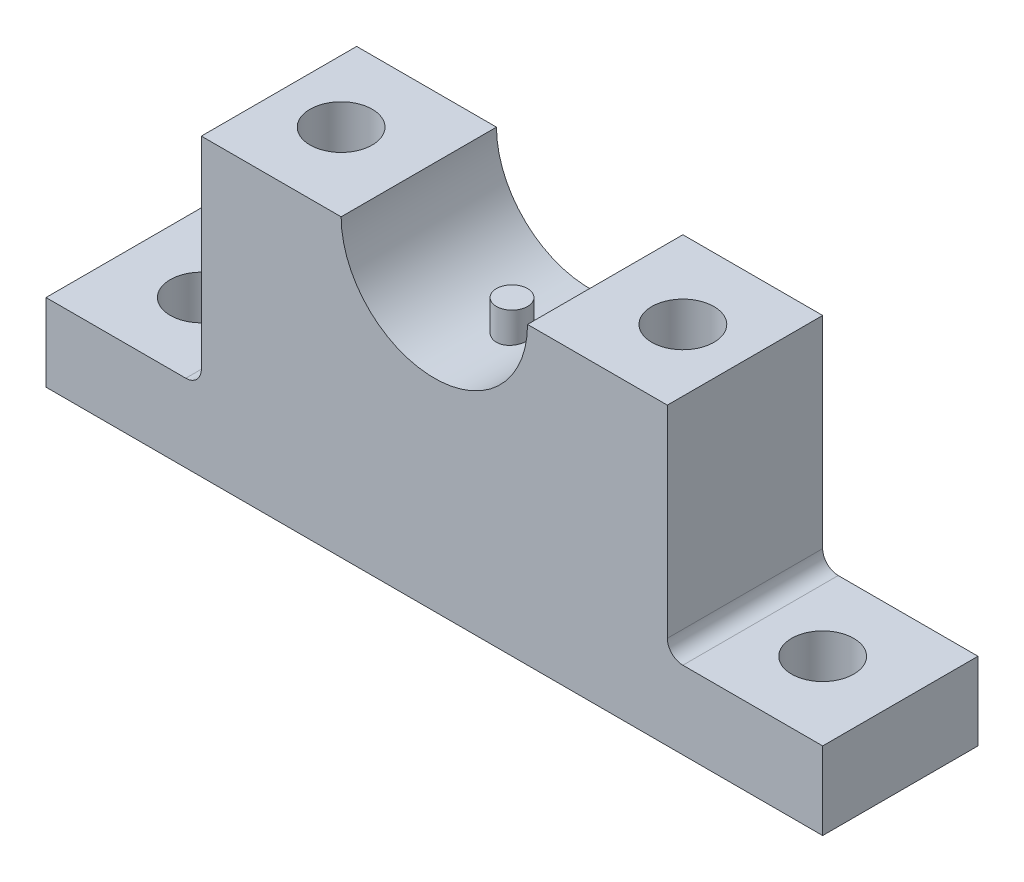
ISO-10303-21;
HEADER;
FILE_DESCRIPTION(('STEP AP214'),'2;1');
FILE_NAME('part.step','',(''),(''),'','','');
FILE_SCHEMA(('AUTOMOTIVE_DESIGN { 1 0 10303 214 1 1 1 1 }'));
ENDSEC;
DATA;
#1=APPLICATION_CONTEXT('core data for automotive mechanical design processes');
#2=APPLICATION_PROTOCOL_DEFINITION('international standard','automotive_design',2000,#1);
#3=PRODUCT_CONTEXT('',#1,'mechanical');
#4=PRODUCT('Part','Part','',(#3));
#5=PRODUCT_RELATED_PRODUCT_CATEGORY('part','',(#4));
#6=PRODUCT_DEFINITION_FORMATION('','',#4);
#7=PRODUCT_DEFINITION_CONTEXT('part definition',#1,'design');
#8=PRODUCT_DEFINITION('design','',#6,#7);
#9=PRODUCT_DEFINITION_SHAPE('','',#8);
#10=(LENGTH_UNIT() NAMED_UNIT(*) SI_UNIT(.MILLI.,.METRE.));
#11=(NAMED_UNIT(*) PLANE_ANGLE_UNIT() SI_UNIT($,.RADIAN.));
#12=(NAMED_UNIT(*) SI_UNIT($,.STERADIAN.) SOLID_ANGLE_UNIT());
#13=UNCERTAINTY_MEASURE_WITH_UNIT(LENGTH_MEASURE(1.E-05),#10,'distance_accuracy_value','');
#14=(GEOMETRIC_REPRESENTATION_CONTEXT(3) GLOBAL_UNCERTAINTY_ASSIGNED_CONTEXT((#13)) GLOBAL_UNIT_ASSIGNED_CONTEXT((#10,
#11,#12)) REPRESENTATION_CONTEXT('',''));
#15=CARTESIAN_POINT('',(0.,0.,0.));
#16=DIRECTION('',(0.,0.,1.));
#17=DIRECTION('',(1.,0.,0.));
#18=AXIS2_PLACEMENT_3D('',#15,#16,#17);
#19=CARTESIAN_POINT('',(0.,0.,5.));
#20=DIRECTION('',(0.,0.,-1.));
#21=DIRECTION('',(-1.,0.,0.));
#22=AXIS2_PLACEMENT_3D('',#19,#20,#21);
#23=CYLINDRICAL_SURFACE('',#22,6.);
#24=CARTESIAN_POINT('',(0.,-6.,1.));
#25=CARTESIAN_POINT('',(0.055756361983286,-5.99999904467529,0.999997764420874));
#26=CARTESIAN_POINT('',(0.111543152735528,-5.99921471165214,0.995321090012433));
#27=CARTESIAN_POINT('',(0.221552088669217,-5.99616137976555,0.976745736493871));
#28=CARTESIAN_POINT('',(0.275772747183699,-5.99389101569556,0.96283857723536));
#29=CARTESIAN_POINT('',(0.381041898885058,-5.9881202729458,0.926233820562899));
#30=CARTESIAN_POINT('',(0.432092947372761,-5.98462090063677,0.903543413743771));
#31=CARTESIAN_POINT('',(0.529656736791178,-5.97677690832828,0.850035083179043));
#32=CARTESIAN_POINT('',(0.576169995951437,-5.97243238501774,0.819218089006802));
#33=CARTESIAN_POINT('',(0.663789045716673,-5.96333326983325,0.750017966471817));
#34=CARTESIAN_POINT('',(0.704845161413988,-5.95857548725943,0.711572354145549));
#35=CARTESIAN_POINT('',(0.779955399463972,-5.94921050750693,0.628340812610876));
#36=CARTESIAN_POINT('',(0.814009079756389,-5.94460331985067,0.583554483417356));
#37=CARTESIAN_POINT('',(0.874346850242054,-5.93603026303912,0.488571613521178));
#38=CARTESIAN_POINT('',(0.900581821144402,-5.93206851636654,0.438343465278098));
#39=CARTESIAN_POINT('',(0.944223346164489,-5.9252791591787,0.33411617427975));
#40=CARTESIAN_POINT('',(0.961630496626246,-5.92245147205723,0.280117286528948));
#41=CARTESIAN_POINT('',(0.986965751113924,-5.91828214737102,0.170407890057385));
#42=CARTESIAN_POINT('',(0.994979611654162,-5.9169270739428,0.114717705399443));
#43=CARTESIAN_POINT('',(1.00156669011595,-5.9158157557466,0.00276788924661156));
#44=CARTESIAN_POINT('',(1.0001405761556,-5.91605939782886,-0.0534917016669197));
#45=CARTESIAN_POINT('',(0.987958039358462,-5.91810571545422,-0.16437114451018));
#46=CARTESIAN_POINT('',(0.97729795275591,-5.91989229327567,-0.219001921418094));
#47=CARTESIAN_POINT('',(0.947101256161379,-5.92479798084403,-0.325688527131654));
#48=CARTESIAN_POINT('',(0.927564341727897,-5.92791713629309,-0.377744267555419));
#49=CARTESIAN_POINT('',(0.880070898437566,-5.9351539173364,-0.478091529376368));
#50=CARTESIAN_POINT('',(0.852074365551886,-5.9392762684293,-0.526363762432491));
#51=CARTESIAN_POINT('',(0.788484807022974,-5.94805167366003,-0.617561760215355));
#52=CARTESIAN_POINT('',(0.752891168261716,-5.95270477061714,-0.660487092981973));
#53=CARTESIAN_POINT('',(0.674592884863622,-5.96208811151914,-0.740330434322939));
#54=CARTESIAN_POINT('',(0.631805585549252,-5.96681859692661,-0.777167407416034));
#55=CARTESIAN_POINT('',(0.540614099592659,-5.97577040558689,-0.843151105066137));
#56=CARTESIAN_POINT('',(0.492209876762569,-5.97999172555898,-0.872297780073292));
#57=CARTESIAN_POINT('',(0.391082366466685,-5.98745557157165,-0.922080890854514));
#58=CARTESIAN_POINT('',(0.338355490225865,-5.99069727362979,-0.942710167732504));
#59=CARTESIAN_POINT('',(0.230119338241093,-5.99583001205064,-0.974797686098392));
#60=CARTESIAN_POINT('',(0.174610295671787,-5.9977211614019,-0.986256694789488));
#61=CARTESIAN_POINT('',(0.0630839605206497,-5.99992451937074,-0.999568543384455));
#62=CARTESIAN_POINT('',(0.00708029486040463,-6.00025501205114,-1.00153262872224));
#63=CARTESIAN_POINT('',(-0.104455909155955,-5.99934989768468,-0.996095462228752));
#64=CARTESIAN_POINT('',(-0.159988465556816,-5.99811435089647,-0.988694570746507));
#65=CARTESIAN_POINT('',(-0.268662470218706,-5.99422730775281,-0.96483006026581));
#66=CARTESIAN_POINT('',(-0.321816347354152,-5.99158441920524,-0.948421516643951));
#67=CARTESIAN_POINT('',(-0.424618753944177,-5.98517785782143,-0.907066192720187));
#68=CARTESIAN_POINT('',(-0.474267086363888,-5.98141412204808,-0.882118932945892));
#69=CARTESIAN_POINT('',(-0.569132275787584,-5.97313806520963,-0.824139550121286));
#70=CARTESIAN_POINT('',(-0.614306100374859,-5.96861942354809,-0.7910379375331));
#71=CARTESIAN_POINT('',(-0.698497434201076,-5.9593538695676,-0.717785073845977));
#72=CARTESIAN_POINT('',(-0.737514495878634,-5.95460694068619,-0.677633310689333));
#73=CARTESIAN_POINT('',(-0.808697111863201,-5.94536070094338,-0.590920980771431));
#74=CARTESIAN_POINT('',(-0.840787504445487,-5.94086446454842,-0.544298333794237));
#75=CARTESIAN_POINT('',(-0.896680924117995,-5.93268611911154,-0.446258812344586));
#76=CARTESIAN_POINT('',(-0.92048421390793,-5.92900398426408,-0.394842089909003));
#77=CARTESIAN_POINT('',(-0.95901533258926,-5.92289381479082,-0.288884106875147));
#78=CARTESIAN_POINT('',(-0.973780573019179,-5.92046061724426,-0.234356761987805));
#79=CARTESIAN_POINT('',(-0.993934181511312,-5.91711086734104,-0.123551948311296));
#80=CARTESIAN_POINT('',(-0.999323364778468,-5.91619418313089,-0.0672746321071795));
#81=CARTESIAN_POINT('',(-1.00054914641894,-5.91598693233605,0.0446820663849635));
#82=CARTESIAN_POINT('',(-0.996504054450076,-5.9166762260226,0.100360151430115));
#83=CARTESIAN_POINT('',(-0.97923193558274,-5.91955912581491,0.210231699220306));
#84=CARTESIAN_POINT('',(-0.966004938444992,-5.92175272704486,0.264425166776749));
#85=CARTESIAN_POINT('',(-0.930789795837962,-5.92738942512687,0.369743374917046));
#86=CARTESIAN_POINT('',(-0.908811836240178,-5.93083106887868,0.42087160402241));
#87=CARTESIAN_POINT('',(-0.856730801566364,-5.93857747568883,0.518734267677939));
#88=CARTESIAN_POINT('',(-0.826627323499426,-5.9428822815536,0.565468484148854));
#89=CARTESIAN_POINT('',(-0.758727553748863,-5.95193381618249,0.653814233243102));
#90=CARTESIAN_POINT('',(-0.72084422543746,-5.95668518230521,0.69535840668011));
#91=CARTESIAN_POINT('',(-0.638643612552093,-5.96605748944336,0.771540641789975));
#92=CARTESIAN_POINT('',(-0.594324845165055,-5.97067840010619,0.806177107455269));
#93=CARTESIAN_POINT('',(-0.500147667856113,-5.97930611856888,0.867779307279979));
#94=CARTESIAN_POINT('',(-0.450253115013128,-5.98330846501242,0.894690415725181));
#95=CARTESIAN_POINT('',(-0.346605227751593,-5.9902046704071,0.939707793843969));
#96=CARTESIAN_POINT('',(-0.292855797932004,-5.99309963270993,0.95782283243188));
#97=CARTESIAN_POINT('',(-0.199081324018161,-5.99682316333182,0.980802109650667));
#98=CARTESIAN_POINT('',(-0.159623532119379,-5.99800810909344,0.987989787846387));
#99=CARTESIAN_POINT('',(-0.0801157241279241,-5.99959686394448,0.997589495137902));
#100=CARTESIAN_POINT('',(-0.0400657182433979,-6.00000068648257,1.00000160645495));
#101=CARTESIAN_POINT('',(0.,-6.,1.));
#102=B_SPLINE_CURVE_WITH_KNOTS('',3,(#24,#25,#26,#27,#28,#29,#30,#31,#32,#33,#34,#35,#36,#37,
#38,#39,#40,#41,#42,#43,#44,#45,#46,#47,#48,#49,#50,#51,#52,#53,#54,#55,#56,#57,#58,#59,#60,#61,
#62,#63,#64,#65,#66,#67,#68,#69,#70,#71,#72,#73,#74,#75,#76,#77,#78,#79,#80,#81,#82,#83,#84,#85,
#86,#87,#88,#89,#90,#91,#92,#93,#94,#95,#96,#97,#98,#99,#100,#101),.UNSPECIFIED.,.T.,.F.,(4,2,2,
2,2,2,2,2,2,2,2,2,2,2,2,2,2,2,2,2,2,2,2,2,2,2,2,2,2,2,2,2,2,2,2,2,2,2,4),(0.,0.167122633975404,
0.334399018278168,0.501538746810108,0.668659365069917,0.837209964249329,1.00577120067943,
1.17537008329536,1.34495750750473,1.5129843084137,1.68099921728355,1.84728208704164,
2.01357066010153,2.18065822653023,2.3477592827223,2.51693107964531,2.68610396654339,
2.85541875566362,3.0247193780846,3.19203153396559,3.35933725214344,3.52563122802567,
3.69193454330427,3.8597073025081,4.02749225221714,4.19701528803048,4.36653294950378,
4.53534408936709,4.70414055114648,4.87083163809081,5.03752218475254,5.2040192729049,
5.37052462011735,5.53900553677357,5.7075253355159,5.87720892642881,6.04672300852029,
6.16681699265608,6.28690890910788),.UNSPECIFIED.);
#103=CARTESIAN_POINT('',(0.,-6.,1.));
#104=VERTEX_POINT('',#103);
#105=EDGE_CURVE('E11',#104,#104,#102,.T.);
#106=ORIENTED_EDGE('',*,*,#105,.F.);
#107=EDGE_LOOP('',(#106));
#108=FACE_BOUND('',#107,.T.);
#109=ADVANCED_FACE('F45',(#108),#23,.T.);
#110=CARTESIAN_POINT('',(0.,-4.,0.));
#111=DIRECTION('',(0.,1.,0.));
#112=DIRECTION('',(0.,0.,1.));
#113=AXIS2_PLACEMENT_3D('',#110,#111,#112);
#114=PLANE('',#113);
#115=CARTESIAN_POINT('',(0.,-4.,0.));
#116=DIRECTION('',(0.,1.,0.));
#117=DIRECTION('',(0.,0.,1.));
#118=AXIS2_PLACEMENT_3D('',#115,#116,#117);
#119=CIRCLE('',#118,1.);
#120=CARTESIAN_POINT('',(0.,-4.,1.));
#121=VERTEX_POINT('',#120);
#122=EDGE_CURVE('E55',#121,#121,#119,.T.);
#123=ORIENTED_EDGE('',*,*,#122,.T.);
#124=EDGE_LOOP('',(#123));
#125=FACE_BOUND('',#124,.T.);
#126=ADVANCED_FACE('F61',(#125),#114,.T.);
#127=CARTESIAN_POINT('',(0.,-19.001,0.));
#128=DIRECTION('',(0.,1.,0.));
#129=DIRECTION('',(0.,0.,1.));
#130=AXIS2_PLACEMENT_3D('',#127,#128,#129);
#131=CYLINDRICAL_SURFACE('',#130,1.);
#132=ORIENTED_EDGE('',*,*,#122,.F.);
#133=EDGE_LOOP('',(#132));
#134=FACE_BOUND('',#133,.T.);
#135=ORIENTED_EDGE('',*,*,#105,.T.);
#136=EDGE_LOOP('',(#135));
#137=FACE_BOUND('',#136,.T.);
#138=ADVANCED_FACE('F63',(#134,#137),#131,.T.);
#139=CLOSED_SHELL('',(#109,#126,#138));
#140=MANIFOLD_SOLID_BREP('B2',#139);
#141=CARTESIAN_POINT('',(0.,0.,5.));
#142=DIRECTION('',(0.,0.,-1.));
#143=DIRECTION('',(-1.,0.,0.));
#144=AXIS2_PLACEMENT_3D('',#141,#142,#143);
#145=CYLINDRICAL_SURFACE('',#144,6.);
#146=CARTESIAN_POINT('',(-0.999999999999999,-5.91607978309962,0.));
#147=CARTESIAN_POINT('',(-0.999997759368401,-5.91608078960511,-0.0557502992584118));
#148=CARTESIAN_POINT('',(-0.995322067614928,-5.91687637019227,-0.111531042409948));
#149=CARTESIAN_POINT('',(-0.976750971230156,-5.91996982947271,-0.221527417288066));
#150=CARTESIAN_POINT('',(-0.96284706412386,-5.92226909356571,-0.27574155749981));
#151=CARTESIAN_POINT('',(-0.926251817466856,-5.9281024372893,-0.380996913342711));
#152=CARTESIAN_POINT('',(-0.903567821972434,-5.9316354846878,-0.432040739466525));
#153=CARTESIAN_POINT('',(-0.850074598756146,-5.93953708845736,-0.529592381885484));
#154=CARTESIAN_POINT('',(-0.819266285400627,-5.94390555078989,-0.576100707830495));
#155=CARTESIAN_POINT('',(-0.750075010786519,-5.95303388461043,-0.663725139898267));
#156=CARTESIAN_POINT('',(-0.711627619572908,-5.95779686930827,-0.704790052554605));
#157=CARTESIAN_POINT('',(-0.628388801878135,-5.96714992267783,-0.779917322744606));
#158=CARTESIAN_POINT('',(-0.583596999659995,-5.97173998108788,-0.813979265246135));
#159=CARTESIAN_POINT('',(-0.488609147979335,-5.98026294792988,-0.874325826887742));
#160=CARTESIAN_POINT('',(-0.438382432582681,-5.98419176972911,-0.90056280309273));
#161=CARTESIAN_POINT('',(-0.334158248689549,-5.99091494782862,-0.944208428212213));
#162=CARTESIAN_POINT('',(-0.280161025631275,-5.9937093778907,-0.961617651153948));
#163=CARTESIAN_POINT('',(-0.170457490537696,-5.99782693889752,-0.986957013993562));
#164=CARTESIAN_POINT('',(-0.114771554671708,-5.99916341244362,-0.994973166401878));
#165=CARTESIAN_POINT('',(-0.00283011421031848,-6.00026031737112,-1.00156630166104));
#166=CARTESIAN_POINT('',(0.0534253514115599,-6.00002085587723,-1.00014392609889));
#167=CARTESIAN_POINT('',(0.164320874031551,-5.99800343372556,-0.987967459388716));
#168=CARTESIAN_POINT('',(0.218971412280057,-5.99624073476959,-0.977305934636339));
#169=CARTESIAN_POINT('',(0.325696791844717,-5.99139191508655,-0.947099570301403));
#170=CARTESIAN_POINT('',(0.377771554660602,-5.98830575405284,-0.9275544601642));
#171=CARTESIAN_POINT('',(0.47814245911306,-5.98113079404783,-0.880043743873873));
#172=CARTESIAN_POINT('',(0.526420209207618,-5.97703746930752,-0.852039995167024));
#173=CARTESIAN_POINT('',(0.617626211938657,-5.96830295228599,-0.788434870945981));
#174=CARTESIAN_POINT('',(0.660554031166351,-5.96366171567654,-0.752832880515674));
#175=CARTESIAN_POINT('',(0.740388509378667,-5.95428107293038,-0.674528477352278));
#176=CARTESIAN_POINT('',(0.777215800901283,-5.94954115892417,-0.631745162039607));
#177=CARTESIAN_POINT('',(0.843181835379226,-5.94055183913922,-0.540565163913673));
#178=CARTESIAN_POINT('',(0.872320507412967,-5.9363024378853,-0.492168429326873));
#179=CARTESIAN_POINT('',(0.922097773795315,-5.92877501824727,-0.391043343249009));
#180=CARTESIAN_POINT('',(0.942726810911697,-5.9254980932104,-0.338310200763164));
#181=CARTESIAN_POINT('',(0.974811948326248,-5.92030475475952,-0.230060371076983));
#182=CARTESIAN_POINT('',(0.986268856307183,-5.91838822155328,-0.174543929427031));
#183=CARTESIAN_POINT('',(0.999572753951707,-5.91615583768846,-0.0630135375351479));
#184=CARTESIAN_POINT('',(1.00153288316498,-5.91582114303468,-0.00701344811915974));
#185=CARTESIAN_POINT('',(0.996089081072984,-5.91674013912944,0.104514668676328));
#186=CARTESIAN_POINT('',(0.988685511449867,-5.91799376852741,0.160042714205589));
#187=CARTESIAN_POINT('',(0.96482093397124,-5.92193074982007,0.268691103676343));
#188=CARTESIAN_POINT('',(0.948417516258555,-5.92460500767339,0.321824455951204));
#189=CARTESIAN_POINT('',(0.907079276076911,-5.93107429202201,0.424588066511794));
#190=CARTESIAN_POINT('',(0.882143943240375,-5.93486938556232,0.474218115020361));
#191=CARTESIAN_POINT('',(0.824182669291692,-5.94319651358957,0.569069837762444));
#192=CARTESIAN_POINT('',(0.791084225663746,-5.94773502240139,0.614246629102423));
#193=CARTESIAN_POINT('',(0.717835786283194,-5.95701866671947,0.698445413078001));
#194=CARTESIAN_POINT('',(0.677685294553619,-5.96176381674132,0.737466972443896));
#195=CARTESIAN_POINT('',(0.590971228131525,-5.97098568847306,0.808660757091481));
#196=CARTESIAN_POINT('',(0.544345301354479,-5.97545910537869,0.840757530513817));
#197=CARTESIAN_POINT('',(0.446297379179731,-5.98358044973177,0.896662130801952));
#198=CARTESIAN_POINT('',(0.394875538988252,-5.9872284038799,0.92047022578954));
#199=CARTESIAN_POINT('',(0.288919620600532,-5.99327343267833,0.959004233581946));
#200=CARTESIAN_POINT('',(0.234400225041045,-5.99567593827049,0.973769630293967));
#201=CARTESIAN_POINT('',(0.123612293949686,-5.99898233267712,0.993926239585532));
#202=CARTESIAN_POINT('',(0.0673439027286505,-5.99988634480071,0.999318223492944));
#203=CARTESIAN_POINT('',(-0.0446165103094716,-6.0000921515513,1.00055275292488));
#204=CARTESIAN_POINT('',(-0.100307264241071,-5.99941320809696,0.996510101576422));
#205=CARTESIAN_POINT('',(-0.210204789725876,-5.99656871354913,0.97923843109224));
#206=CARTESIAN_POINT('',(-0.264411569586969,-5.99440317078001,0.966009463396175));
#207=CARTESIAN_POINT('',(-0.369758578367436,-5.98882795531034,0.930784733782497));
#208=CARTESIAN_POINT('',(-0.420902148861608,-5.98541966816622,0.908798732715821));
#209=CARTESIAN_POINT('',(-0.518792181192785,-5.97773102750941,0.856696825507926));
#210=CARTESIAN_POINT('',(-0.565538434446985,-5.97345063265953,0.826580533975613));
#211=CARTESIAN_POINT('',(-0.653885178210863,-5.96443051847589,0.758665963015201));
#212=CARTESIAN_POINT('',(-0.695420572242245,-5.95968609820293,0.72078361809725));
#213=CARTESIAN_POINT('',(-0.771585550379216,-5.95030521321901,0.638588676840723));
#214=CARTESIAN_POINT('',(-0.806213514680475,-5.94566877405441,0.594274576443382));
#215=CARTESIAN_POINT('',(-0.867805708367844,-5.93699337428039,0.500101870996945));
#216=CARTESIAN_POINT('',(-0.894713995637815,-5.93295887192494,0.450206264064781));
#217=CARTESIAN_POINT('',(-0.939725814576364,-5.92599684088708,0.346556305635426));
#218=CARTESIAN_POINT('',(-0.95783814209264,-5.92306820700509,0.292805870921243));
#219=CARTESIAN_POINT('',(-0.980810421248856,-5.91929897935112,0.199038492209334));
#220=CARTESIAN_POINT('',(-0.987994967068111,-5.91809849368407,0.159589276816626));
#221=CARTESIAN_POINT('',(-0.997590518072968,-5.91648854114608,0.0800986060635571));
#222=CARTESIAN_POINT('',(-1.00000160991677,-5.91607905991511,0.0400571614679346));
#223=CARTESIAN_POINT('',(-0.999999999999999,-5.91607978309962,0.));
#224=B_SPLINE_CURVE_WITH_KNOTS('',3,(#146,#147,#148,#149,#150,#151,#152,#153,#154,#155,#156,
#157,#158,#159,#160,#161,#162,#163,#164,#165,#166,#167,#168,#169,#170,#171,#172,#173,#174,#175,
#176,#177,#178,#179,#180,#181,#182,#183,#184,#185,#186,#187,#188,#189,#190,#191,#192,#193,#194,
#195,#196,#197,#198,#199,#200,#201,#202,#203,#204,#205,#206,#207,#208,#209,#210,#211,#212,#213,
#214,#215,#216,#217,#218,#219,#220,#221,#222,#223),.UNSPECIFIED.,.T.,.F.,(4,2,2,2,2,2,2,2,2,2,2,
2,2,2,2,2,2,2,2,2,2,2,2,2,2,2,2,2,2,2,2,2,2,2,2,2,2,2,4),(0.,0.167104415562127,
0.334363007967779,0.501481999132666,0.668582189603687,0.83715663660545,1.00574107132038,
1.17533192042833,1.34491174042704,1.51292626987285,1.68092937859336,1.84726848464126,
2.01361265698072,2.18071841654029,2.34783770488965,2.51698449383108,2.68613284296667,
2.85547064997701,3.0247935437349,3.19209416966423,3.3593883336385,3.52562425852456,
3.69187012915689,3.8596493710334,4.02744041770535,4.19697645212412,4.36650700188938,
4.53529193765317,4.70406298363199,4.87079110504626,5.03751829285788,5.20406015931242,
5.37060992155193,5.5390679898356,5.70756551550984,5.8772549104514,6.04677426695051,
6.16684268214775,6.28690891757997),.UNSPECIFIED.);
#225=CARTESIAN_POINT('',(-0.999999999999999,-5.91607978309962,0.));
#226=VERTEX_POINT('',#225);
#227=EDGE_CURVE('E95',#226,#226,#224,.T.);
#228=ORIENTED_EDGE('',*,*,#227,.T.);
#229=EDGE_LOOP('',(#228));
#230=FACE_BOUND('',#229,.T.);
#231=CARTESIAN_POINT('',(0.,0.,-5.));
#232=DIRECTION('',(0.,0.,-1.));
#233=DIRECTION('',(1.,0.,0.));
#234=AXIS2_PLACEMENT_3D('',#231,#232,#233);
#235=CIRCLE('',#234,6.);
#236=CARTESIAN_POINT('',(6.,0.,-5.));
#237=VERTEX_POINT('',#236);
#238=CARTESIAN_POINT('',(-6.,0.,-5.));
#239=VERTEX_POINT('',#238);
#240=EDGE_CURVE('E217',#237,#239,#235,.T.);
#241=ORIENTED_EDGE('',*,*,#240,.T.);
#242=DIRECTION('',(0.,0.,-1.));
#243=VECTOR('',#242,1.);
#244=CARTESIAN_POINT('',(-6.,0.,5.));
#245=LINE('',#244,#243);
#246=CARTESIAN_POINT('',(-6.,0.,5.));
#247=VERTEX_POINT('',#246);
#248=EDGE_CURVE('E43',#247,#239,#245,.T.);
#249=ORIENTED_EDGE('',*,*,#248,.F.);
#250=CARTESIAN_POINT('',(0.,0.,5.));
#251=DIRECTION('',(0.,0.,-1.));
#252=DIRECTION('',(1.,0.,0.));
#253=AXIS2_PLACEMENT_3D('',#250,#251,#252);
#254=CIRCLE('',#253,6.);
#255=CARTESIAN_POINT('',(6.,0.,5.));
#256=VERTEX_POINT('',#255);
#257=EDGE_CURVE('E240',#256,#247,#254,.T.);
#258=ORIENTED_EDGE('',*,*,#257,.F.);
#259=DIRECTION('',(0.,0.,-1.));
#260=VECTOR('',#259,1.);
#261=CARTESIAN_POINT('',(6.,0.,5.));
#262=LINE('',#261,#260);
#263=EDGE_CURVE('E213',#256,#237,#262,.T.);
#264=ORIENTED_EDGE('',*,*,#263,.T.);
#265=EDGE_LOOP('',(#241,#249,#258,#264));
#266=FACE_BOUND('',#265,.T.);
#267=ADVANCED_FACE('F91',(#230,#266),#145,.F.);
#268=CARTESIAN_POINT('',(-6.,0.,5.));
#269=DIRECTION('',(0.,-1.,0.));
#270=DIRECTION('',(1.,0.,0.));
#271=AXIS2_PLACEMENT_3D('',#268,#269,#270);
#272=PLANE('',#271);
#273=CARTESIAN_POINT('',(-11.,0.,0.));
#274=DIRECTION('',(0.,1.,0.));
#275=DIRECTION('',(-1.,0.,0.));
#276=AXIS2_PLACEMENT_3D('',#273,#274,#275);
#277=CIRCLE('',#276,2.);
#278=CARTESIAN_POINT('',(-13.,0.,0.));
#279=VERTEX_POINT('',#278);
#280=EDGE_CURVE('E344',#279,#279,#277,.T.);
#281=ORIENTED_EDGE('',*,*,#280,.F.);
#282=EDGE_LOOP('',(#281));
#283=FACE_BOUND('',#282,.T.);
#284=DIRECTION('',(-1.,0.,0.));
#285=VECTOR('',#284,1.);
#286=CARTESIAN_POINT('',(-6.,0.,-5.));
#287=LINE('',#286,#285);
#288=CARTESIAN_POINT('',(-15.,0.,-5.));
#289=VERTEX_POINT('',#288);
#290=EDGE_CURVE('E220',#239,#289,#287,.T.);
#291=ORIENTED_EDGE('',*,*,#290,.T.);
#292=DIRECTION('',(0.,0.,-1.));
#293=VECTOR('',#292,1.);
#294=CARTESIAN_POINT('',(-15.,0.,5.));
#295=LINE('',#294,#293);
#296=CARTESIAN_POINT('',(-15.,0.,5.));
#297=VERTEX_POINT('',#296);
#298=EDGE_CURVE('E105',#297,#289,#295,.T.);
#299=ORIENTED_EDGE('',*,*,#298,.F.);
#300=DIRECTION('',(-1.,0.,0.));
#301=VECTOR('',#300,1.);
#302=CARTESIAN_POINT('',(-6.,0.,5.));
#303=LINE('',#302,#301);
#304=EDGE_CURVE('E168',#247,#297,#303,.T.);
#305=ORIENTED_EDGE('',*,*,#304,.F.);
#306=ORIENTED_EDGE('',*,*,#248,.T.);
#307=EDGE_LOOP('',(#291,#299,#305,#306));
#308=FACE_BOUND('',#307,.T.);
#309=ADVANCED_FACE('F321',(#283,#308),#272,.F.);
#310=CARTESIAN_POINT('',(-15.,0.,5.));
#311=DIRECTION('',(1.,0.,0.));
#312=DIRECTION('',(0.,0.,-1.));
#313=AXIS2_PLACEMENT_3D('',#310,#311,#312);
#314=PLANE('',#313);
#315=DIRECTION('',(0.,-1.,0.));
#316=VECTOR('',#315,1.);
#317=CARTESIAN_POINT('',(-15.,0.,-5.));
#318=LINE('',#317,#316);
#319=CARTESIAN_POINT('',(-15.,-13.,-5.));
#320=VERTEX_POINT('',#319);
#321=EDGE_CURVE('E223',#289,#320,#318,.T.);
#322=ORIENTED_EDGE('',*,*,#321,.T.);
#323=DIRECTION('',(0.,0.,-1.));
#324=VECTOR('',#323,1.);
#325=CARTESIAN_POINT('',(-15.,-13.,5.));
#326=LINE('',#325,#324);
#327=CARTESIAN_POINT('',(-15.,-13.,5.));
#328=VERTEX_POINT('',#327);
#329=EDGE_CURVE('E259',#328,#320,#326,.T.);
#330=ORIENTED_EDGE('',*,*,#329,.F.);
#331=DIRECTION('',(0.,-1.,0.));
#332=VECTOR('',#331,1.);
#333=CARTESIAN_POINT('',(-15.,0.,5.));
#334=LINE('',#333,#332);
#335=EDGE_CURVE('E268',#297,#328,#334,.T.);
#336=ORIENTED_EDGE('',*,*,#335,.F.);
#337=ORIENTED_EDGE('',*,*,#298,.T.);
#338=EDGE_LOOP('',(#322,#330,#336,#337));
#339=FACE_BOUND('',#338,.T.);
#340=ADVANCED_FACE('F266',(#339),#314,.F.);
#341=CARTESIAN_POINT('',(-16.,-13.,5.));
#342=DIRECTION('',(0.,0.,-1.));
#343=DIRECTION('',(-1.,0.,0.));
#344=AXIS2_PLACEMENT_3D('',#341,#342,#343);
#345=CYLINDRICAL_SURFACE('',#344,1.);
#346=CARTESIAN_POINT('',(-16.,-13.,-5.));
#347=DIRECTION('',(0.,0.,-1.));
#348=DIRECTION('',(-1.,0.,0.));
#349=AXIS2_PLACEMENT_3D('',#346,#347,#348);
#350=CIRCLE('',#349,1.);
#351=CARTESIAN_POINT('',(-16.,-14.,-5.));
#352=VERTEX_POINT('',#351);
#353=EDGE_CURVE('E225',#320,#352,#350,.T.);
#354=ORIENTED_EDGE('',*,*,#353,.T.);
#355=DIRECTION('',(0.,0.,-1.));
#356=VECTOR('',#355,1.);
#357=CARTESIAN_POINT('',(-16.,-14.,5.));
#358=LINE('',#357,#356);
#359=CARTESIAN_POINT('',(-16.,-14.,5.));
#360=VERTEX_POINT('',#359);
#361=EDGE_CURVE('E256',#360,#352,#358,.T.);
#362=ORIENTED_EDGE('',*,*,#361,.F.);
#363=CARTESIAN_POINT('',(-16.,-13.,5.));
#364=DIRECTION('',(0.,0.,-1.));
#365=DIRECTION('',(-1.,0.,0.));
#366=AXIS2_PLACEMENT_3D('',#363,#364,#365);
#367=CIRCLE('',#366,1.);
#368=EDGE_CURVE('E286',#328,#360,#367,.T.);
#369=ORIENTED_EDGE('',*,*,#368,.F.);
#370=ORIENTED_EDGE('',*,*,#329,.T.);
#371=EDGE_LOOP('',(#354,#362,#369,#370));
#372=FACE_BOUND('',#371,.T.);
#373=ADVANCED_FACE('F277',(#372),#345,.F.);
#374=CARTESIAN_POINT('',(-16.,-14.,5.));
#375=DIRECTION('',(0.,-1.,0.));
#376=DIRECTION('',(1.,0.,0.));
#377=AXIS2_PLACEMENT_3D('',#374,#375,#376);
#378=PLANE('',#377);
#379=CARTESIAN_POINT('',(-20.,-14.,0.));
#380=DIRECTION('',(0.,1.,0.));
#381=DIRECTION('',(-1.,0.,0.));
#382=AXIS2_PLACEMENT_3D('',#379,#380,#381);
#383=CIRCLE('',#382,2.);
#384=CARTESIAN_POINT('',(-22.,-14.,0.));
#385=VERTEX_POINT('',#384);
#386=EDGE_CURVE('E351',#385,#385,#383,.T.);
#387=ORIENTED_EDGE('',*,*,#386,.F.);
#388=EDGE_LOOP('',(#387));
#389=FACE_BOUND('',#388,.T.);
#390=DIRECTION('',(-1.,0.,0.));
#391=VECTOR('',#390,1.);
#392=CARTESIAN_POINT('',(-16.,-14.,-5.));
#393=LINE('',#392,#391);
#394=CARTESIAN_POINT('',(-25.,-14.,-5.));
#395=VERTEX_POINT('',#394);
#396=EDGE_CURVE('E227',#352,#395,#393,.T.);
#397=ORIENTED_EDGE('',*,*,#396,.T.);
#398=DIRECTION('',(0.,0.,-1.));
#399=VECTOR('',#398,1.);
#400=CARTESIAN_POINT('',(-25.,-14.,5.));
#401=LINE('',#400,#399);
#402=CARTESIAN_POINT('',(-25.,-14.,5.));
#403=VERTEX_POINT('',#402);
#404=EDGE_CURVE('E253',#403,#395,#401,.T.);
#405=ORIENTED_EDGE('',*,*,#404,.F.);
#406=DIRECTION('',(-1.,0.,0.));
#407=VECTOR('',#406,1.);
#408=CARTESIAN_POINT('',(-16.,-14.,5.));
#409=LINE('',#408,#407);
#410=EDGE_CURVE('E283',#360,#403,#409,.T.);
#411=ORIENTED_EDGE('',*,*,#410,.F.);
#412=ORIENTED_EDGE('',*,*,#361,.T.);
#413=EDGE_LOOP('',(#397,#405,#411,#412));
#414=FACE_BOUND('',#413,.T.);
#415=ADVANCED_FACE('F281',(#389,#414),#378,.F.);
#416=CARTESIAN_POINT('',(-25.,-14.,5.));
#417=DIRECTION('',(1.,0.,0.));
#418=DIRECTION('',(0.,1.,0.));
#419=AXIS2_PLACEMENT_3D('',#416,#417,#418);
#420=PLANE('',#419);
#421=DIRECTION('',(0.,-1.,0.));
#422=VECTOR('',#421,1.);
#423=CARTESIAN_POINT('',(-25.,-14.,-5.));
#424=LINE('',#423,#422);
#425=CARTESIAN_POINT('',(-25.,-19.,-5.));
#426=VERTEX_POINT('',#425);
#427=EDGE_CURVE('E229',#395,#426,#424,.T.);
#428=ORIENTED_EDGE('',*,*,#427,.T.);
#429=DIRECTION('',(0.,0.,-1.));
#430=VECTOR('',#429,1.);
#431=CARTESIAN_POINT('',(-25.,-19.,5.));
#432=LINE('',#431,#430);
#433=CARTESIAN_POINT('',(-25.,-19.,5.));
#434=VERTEX_POINT('',#433);
#435=EDGE_CURVE('E250',#434,#426,#432,.T.);
#436=ORIENTED_EDGE('',*,*,#435,.F.);
#437=DIRECTION('',(0.,-1.,0.));
#438=VECTOR('',#437,1.);
#439=CARTESIAN_POINT('',(-25.,-14.,5.));
#440=LINE('',#439,#438);
#441=EDGE_CURVE('E285',#403,#434,#440,.T.);
#442=ORIENTED_EDGE('',*,*,#441,.F.);
#443=ORIENTED_EDGE('',*,*,#404,.T.);
#444=EDGE_LOOP('',(#428,#436,#442,#443));
#445=FACE_BOUND('',#444,.T.);
#446=ADVANCED_FACE('F376',(#445),#420,.F.);
#447=CARTESIAN_POINT('',(-25.,-19.,5.));
#448=DIRECTION('',(0.,1.,0.));
#449=DIRECTION('',(-1.,0.,0.));
#450=AXIS2_PLACEMENT_3D('',#447,#448,#449);
#451=PLANE('',#450);
#452=CARTESIAN_POINT('',(-20.,-19.,0.));
#453=DIRECTION('',(0.,1.,0.));
#454=DIRECTION('',(-1.,0.,0.));
#455=AXIS2_PLACEMENT_3D('',#452,#453,#454);
#456=CIRCLE('',#455,2.);
#457=CARTESIAN_POINT('',(-22.,-19.,0.));
#458=VERTEX_POINT('',#457);
#459=EDGE_CURVE('E221',#458,#458,#456,.T.);
#460=ORIENTED_EDGE('',*,*,#459,.T.);
#461=EDGE_LOOP('',(#460));
#462=FACE_BOUND('',#461,.T.);
#463=CARTESIAN_POINT('',(20.,-19.,0.));
#464=DIRECTION('',(0.,1.,0.));
#465=DIRECTION('',(-1.,0.,0.));
#466=AXIS2_PLACEMENT_3D('',#463,#464,#465);
#467=CIRCLE('',#466,2.);
#468=CARTESIAN_POINT('',(18.,-19.,0.));
#469=VERTEX_POINT('',#468);
#470=EDGE_CURVE('E354',#469,#469,#467,.T.);
#471=ORIENTED_EDGE('',*,*,#470,.T.);
#472=EDGE_LOOP('',(#471));
#473=FACE_BOUND('',#472,.T.);
#474=DIRECTION('',(1.,0.,0.));
#475=VECTOR('',#474,1.);
#476=CARTESIAN_POINT('',(-25.,-19.,-5.));
#477=LINE('',#476,#475);
#478=CARTESIAN_POINT('',(25.,-19.,-5.));
#479=VERTEX_POINT('',#478);
#480=EDGE_CURVE('E231',#426,#479,#477,.T.);
#481=ORIENTED_EDGE('',*,*,#480,.T.);
#482=DIRECTION('',(0.,0.,-1.));
#483=VECTOR('',#482,1.);
#484=CARTESIAN_POINT('',(25.,-19.,5.));
#485=LINE('',#484,#483);
#486=CARTESIAN_POINT('',(25.,-19.,5.));
#487=VERTEX_POINT('',#486);
#488=EDGE_CURVE('E247',#487,#479,#485,.T.);
#489=ORIENTED_EDGE('',*,*,#488,.F.);
#490=DIRECTION('',(1.,0.,0.));
#491=VECTOR('',#490,1.);
#492=CARTESIAN_POINT('',(-25.,-19.,5.));
#493=LINE('',#492,#491);
#494=EDGE_CURVE('E288',#434,#487,#493,.T.);
#495=ORIENTED_EDGE('',*,*,#494,.F.);
#496=ORIENTED_EDGE('',*,*,#435,.T.);
#497=EDGE_LOOP('',(#481,#489,#495,#496));
#498=FACE_BOUND('',#497,.T.);
#499=ADVANCED_FACE('F371',(#462,#473,#498),#451,.F.);
#500=CARTESIAN_POINT('',(25.,-19.,5.));
#501=DIRECTION('',(-1.,0.,0.));
#502=DIRECTION('',(0.,-1.,0.));
#503=AXIS2_PLACEMENT_3D('',#500,#501,#502);
#504=PLANE('',#503);
#505=DIRECTION('',(0.,1.,0.));
#506=VECTOR('',#505,1.);
#507=CARTESIAN_POINT('',(25.,-19.,-5.));
#508=LINE('',#507,#506);
#509=CARTESIAN_POINT('',(25.,-14.,-5.));
#510=VERTEX_POINT('',#509);
#511=EDGE_CURVE('E233',#479,#510,#508,.T.);
#512=ORIENTED_EDGE('',*,*,#511,.T.);
#513=DIRECTION('',(0.,0.,-1.));
#514=VECTOR('',#513,1.);
#515=CARTESIAN_POINT('',(25.,-14.,5.));
#516=LINE('',#515,#514);
#517=CARTESIAN_POINT('',(25.,-14.,5.));
#518=VERTEX_POINT('',#517);
#519=EDGE_CURVE('E244',#518,#510,#516,.T.);
#520=ORIENTED_EDGE('',*,*,#519,.F.);
#521=DIRECTION('',(0.,1.,0.));
#522=VECTOR('',#521,1.);
#523=CARTESIAN_POINT('',(25.,-19.,5.));
#524=LINE('',#523,#522);
#525=EDGE_CURVE('E294',#487,#518,#524,.T.);
#526=ORIENTED_EDGE('',*,*,#525,.F.);
#527=ORIENTED_EDGE('',*,*,#488,.T.);
#528=EDGE_LOOP('',(#512,#520,#526,#527));
#529=FACE_BOUND('',#528,.T.);
#530=ADVANCED_FACE('F300',(#529),#504,.F.);
#531=CARTESIAN_POINT('',(25.,-14.,5.));
#532=DIRECTION('',(0.,-1.,0.));
#533=DIRECTION('',(1.,0.,0.));
#534=AXIS2_PLACEMENT_3D('',#531,#532,#533);
#535=PLANE('',#534);
#536=CARTESIAN_POINT('',(20.,-14.,0.));
#537=DIRECTION('',(0.,1.,0.));
#538=DIRECTION('',(-1.,0.,0.));
#539=AXIS2_PLACEMENT_3D('',#536,#537,#538);
#540=CIRCLE('',#539,2.);
#541=CARTESIAN_POINT('',(18.,-14.,0.));
#542=VERTEX_POINT('',#541);
#543=EDGE_CURVE('E343',#542,#542,#540,.T.);
#544=ORIENTED_EDGE('',*,*,#543,.F.);
#545=EDGE_LOOP('',(#544));
#546=FACE_BOUND('',#545,.T.);
#547=DIRECTION('',(-1.,0.,0.));
#548=VECTOR('',#547,1.);
#549=CARTESIAN_POINT('',(25.,-14.,-5.));
#550=LINE('',#549,#548);
#551=CARTESIAN_POINT('',(16.,-14.,-5.));
#552=VERTEX_POINT('',#551);
#553=EDGE_CURVE('E235',#510,#552,#550,.T.);
#554=ORIENTED_EDGE('',*,*,#553,.T.);
#555=DIRECTION('',(0.,0.,-1.));
#556=VECTOR('',#555,1.);
#557=CARTESIAN_POINT('',(16.,-14.,5.));
#558=LINE('',#557,#556);
#559=CARTESIAN_POINT('',(16.,-14.,5.));
#560=VERTEX_POINT('',#559);
#561=EDGE_CURVE('E208',#560,#552,#558,.T.);
#562=ORIENTED_EDGE('',*,*,#561,.F.);
#563=DIRECTION('',(-1.,0.,0.));
#564=VECTOR('',#563,1.);
#565=CARTESIAN_POINT('',(25.,-14.,5.));
#566=LINE('',#565,#564);
#567=EDGE_CURVE('E199',#518,#560,#566,.T.);
#568=ORIENTED_EDGE('',*,*,#567,.F.);
#569=ORIENTED_EDGE('',*,*,#519,.T.);
#570=EDGE_LOOP('',(#554,#562,#568,#569));
#571=FACE_BOUND('',#570,.T.);
#572=ADVANCED_FACE('F304',(#546,#571),#535,.F.);
#573=CARTESIAN_POINT('',(16.,-13.,5.));
#574=DIRECTION('',(0.,0.,-1.));
#575=DIRECTION('',(-1.,0.,0.));
#576=AXIS2_PLACEMENT_3D('',#573,#574,#575);
#577=CYLINDRICAL_SURFACE('',#576,1.);
#578=CARTESIAN_POINT('',(16.,-13.,-5.));
#579=DIRECTION('',(0.,0.,-1.));
#580=DIRECTION('',(-1.,0.,0.));
#581=AXIS2_PLACEMENT_3D('',#578,#579,#580);
#582=CIRCLE('',#581,1.);
#583=CARTESIAN_POINT('',(15.,-13.,-5.));
#584=VERTEX_POINT('',#583);
#585=EDGE_CURVE('E207',#552,#584,#582,.T.);
#586=ORIENTED_EDGE('',*,*,#585,.T.);
#587=DIRECTION('',(0.,0.,-1.));
#588=VECTOR('',#587,1.);
#589=CARTESIAN_POINT('',(15.,-13.,5.));
#590=LINE('',#589,#588);
#591=CARTESIAN_POINT('',(15.,-13.,5.));
#592=VERTEX_POINT('',#591);
#593=EDGE_CURVE('E204',#592,#584,#590,.T.);
#594=ORIENTED_EDGE('',*,*,#593,.F.);
#595=CARTESIAN_POINT('',(16.,-13.,5.));
#596=DIRECTION('',(0.,0.,-1.));
#597=DIRECTION('',(-1.,0.,0.));
#598=AXIS2_PLACEMENT_3D('',#595,#596,#597);
#599=CIRCLE('',#598,1.);
#600=EDGE_CURVE('E193',#560,#592,#599,.T.);
#601=ORIENTED_EDGE('',*,*,#600,.F.);
#602=ORIENTED_EDGE('',*,*,#561,.T.);
#603=EDGE_LOOP('',(#586,#594,#601,#602));
#604=FACE_BOUND('',#603,.T.);
#605=ADVANCED_FACE('F205',(#604),#577,.F.);
#606=CARTESIAN_POINT('',(15.,-13.,5.));
#607=DIRECTION('',(-1.,0.,0.));
#608=DIRECTION('',(0.,0.,1.));
#609=AXIS2_PLACEMENT_3D('',#606,#607,#608);
#610=PLANE('',#609);
#611=DIRECTION('',(0.,1.,0.));
#612=VECTOR('',#611,1.);
#613=CARTESIAN_POINT('',(15.,-13.,-5.));
#614=LINE('',#613,#612);
#615=CARTESIAN_POINT('',(15.,0.,-5.));
#616=VERTEX_POINT('',#615);
#617=EDGE_CURVE('E154',#584,#616,#614,.T.);
#618=ORIENTED_EDGE('',*,*,#617,.T.);
#619=DIRECTION('',(0.,0.,-1.));
#620=VECTOR('',#619,1.);
#621=CARTESIAN_POINT('',(15.,0.,5.));
#622=LINE('',#621,#620);
#623=CARTESIAN_POINT('',(15.,0.,5.));
#624=VERTEX_POINT('',#623);
#625=EDGE_CURVE('E209',#624,#616,#622,.T.);
#626=ORIENTED_EDGE('',*,*,#625,.F.);
#627=DIRECTION('',(0.,1.,0.));
#628=VECTOR('',#627,1.);
#629=CARTESIAN_POINT('',(15.,-13.,5.));
#630=LINE('',#629,#628);
#631=EDGE_CURVE('E197',#592,#624,#630,.T.);
#632=ORIENTED_EDGE('',*,*,#631,.F.);
#633=ORIENTED_EDGE('',*,*,#593,.T.);
#634=EDGE_LOOP('',(#618,#626,#632,#633));
#635=FACE_BOUND('',#634,.T.);
#636=ADVANCED_FACE('F211',(#635),#610,.F.);
#637=CARTESIAN_POINT('',(15.,0.,5.));
#638=DIRECTION('',(0.,-1.,0.));
#639=DIRECTION('',(1.,0.,0.));
#640=AXIS2_PLACEMENT_3D('',#637,#638,#639);
#641=PLANE('',#640);
#642=CARTESIAN_POINT('',(11.,0.,0.));
#643=DIRECTION('',(0.,1.,0.));
#644=DIRECTION('',(-1.,0.,0.));
#645=AXIS2_PLACEMENT_3D('',#642,#643,#644);
#646=CIRCLE('',#645,2.);
#647=CARTESIAN_POINT('',(9.,0.,0.));
#648=VERTEX_POINT('',#647);
#649=EDGE_CURVE('E330',#648,#648,#646,.T.);
#650=ORIENTED_EDGE('',*,*,#649,.F.);
#651=EDGE_LOOP('',(#650));
#652=FACE_BOUND('',#651,.T.);
#653=DIRECTION('',(-1.,0.,0.));
#654=VECTOR('',#653,1.);
#655=CARTESIAN_POINT('',(15.,0.,-5.));
#656=LINE('',#655,#654);
#657=EDGE_CURVE('E160',#616,#237,#656,.T.);
#658=ORIENTED_EDGE('',*,*,#657,.T.);
#659=ORIENTED_EDGE('',*,*,#263,.F.);
#660=DIRECTION('',(-1.,0.,0.));
#661=VECTOR('',#660,1.);
#662=CARTESIAN_POINT('',(15.,0.,5.));
#663=LINE('',#662,#661);
#664=EDGE_CURVE('E113',#624,#256,#663,.T.);
#665=ORIENTED_EDGE('',*,*,#664,.F.);
#666=ORIENTED_EDGE('',*,*,#625,.T.);
#667=EDGE_LOOP('',(#658,#659,#665,#666));
#668=FACE_BOUND('',#667,.T.);
#669=ADVANCED_FACE('F308',(#652,#668),#641,.F.);
#670=CARTESIAN_POINT('',(0.,0.,5.));
#671=DIRECTION('',(0.,0.,1.));
#672=DIRECTION('',(1.,0.,0.));
#673=AXIS2_PLACEMENT_3D('',#670,#671,#672);
#674=PLANE('',#673);
#675=ORIENTED_EDGE('',*,*,#257,.T.);
#676=ORIENTED_EDGE('',*,*,#304,.T.);
#677=ORIENTED_EDGE('',*,*,#335,.T.);
#678=ORIENTED_EDGE('',*,*,#368,.T.);
#679=ORIENTED_EDGE('',*,*,#410,.T.);
#680=ORIENTED_EDGE('',*,*,#441,.T.);
#681=ORIENTED_EDGE('',*,*,#494,.T.);
#682=ORIENTED_EDGE('',*,*,#525,.T.);
#683=ORIENTED_EDGE('',*,*,#567,.T.);
#684=ORIENTED_EDGE('',*,*,#600,.T.);
#685=ORIENTED_EDGE('',*,*,#631,.T.);
#686=ORIENTED_EDGE('',*,*,#664,.T.);
#687=EDGE_LOOP('',(#675,#676,#677,#678,#679,#680,#681,#682,#683,#684,#685,#686));
#688=FACE_BOUND('',#687,.T.);
#689=ADVANCED_FACE('F195',(#688),#674,.T.);
#690=CARTESIAN_POINT('',(0.,0.,-5.));
#691=DIRECTION('',(0.,0.,1.));
#692=DIRECTION('',(1.,0.,0.));
#693=AXIS2_PLACEMENT_3D('',#690,#691,#692);
#694=PLANE('',#693);
#695=ORIENTED_EDGE('',*,*,#240,.F.);
#696=ORIENTED_EDGE('',*,*,#657,.F.);
#697=ORIENTED_EDGE('',*,*,#617,.F.);
#698=ORIENTED_EDGE('',*,*,#585,.F.);
#699=ORIENTED_EDGE('',*,*,#553,.F.);
#700=ORIENTED_EDGE('',*,*,#511,.F.);
#701=ORIENTED_EDGE('',*,*,#480,.F.);
#702=ORIENTED_EDGE('',*,*,#427,.F.);
#703=ORIENTED_EDGE('',*,*,#396,.F.);
#704=ORIENTED_EDGE('',*,*,#353,.F.);
#705=ORIENTED_EDGE('',*,*,#321,.F.);
#706=ORIENTED_EDGE('',*,*,#290,.F.);
#707=EDGE_LOOP('',(#695,#696,#697,#698,#699,#700,#701,#702,#703,#704,#705,#706));
#708=FACE_BOUND('',#707,.T.);
#709=ADVANCED_FACE('F272',(#708),#694,.F.);
#710=CARTESIAN_POINT('',(20.,-19.,0.));
#711=DIRECTION('',(0.,1.,0.));
#712=DIRECTION('',(-1.,0.,0.));
#713=AXIS2_PLACEMENT_3D('',#710,#711,#712);
#714=CYLINDRICAL_SURFACE('',#713,2.);
#715=CARTESIAN_POINT('',(18.,-19.,0.));
#716=CARTESIAN_POINT('',(18.,-18.9479166666667,0.));
#717=CARTESIAN_POINT('',(18.,-18.8958333333333,0.));
#718=CARTESIAN_POINT('',(18.,-18.7916666666667,0.));
#719=CARTESIAN_POINT('',(18.,-18.7395833333333,0.));
#720=CARTESIAN_POINT('',(18.,-18.6354166666667,0.));
#721=CARTESIAN_POINT('',(18.,-18.5833333333333,0.));
#722=CARTESIAN_POINT('',(18.,-18.4791666666667,0.));
#723=CARTESIAN_POINT('',(18.,-18.4270833333333,0.));
#724=CARTESIAN_POINT('',(18.,-18.3229166666667,0.));
#725=CARTESIAN_POINT('',(18.,-18.2708333333333,0.));
#726=CARTESIAN_POINT('',(18.,-18.1666666666667,0.));
#727=CARTESIAN_POINT('',(18.,-18.1145833333333,0.));
#728=CARTESIAN_POINT('',(18.,-18.0104166666667,0.));
#729=CARTESIAN_POINT('',(18.,-17.9583333333333,0.));
#730=CARTESIAN_POINT('',(18.,-17.8541666666667,0.));
#731=CARTESIAN_POINT('',(18.,-17.8020833333333,0.));
#732=CARTESIAN_POINT('',(18.,-17.6979166666667,0.));
#733=CARTESIAN_POINT('',(18.,-17.6458333333333,0.));
#734=CARTESIAN_POINT('',(18.,-17.5416666666667,0.));
#735=CARTESIAN_POINT('',(18.,-17.4895833333333,0.));
#736=CARTESIAN_POINT('',(18.,-17.3854166666667,0.));
#737=CARTESIAN_POINT('',(18.,-17.3333333333333,0.));
#738=CARTESIAN_POINT('',(18.,-17.2291666666667,0.));
#739=CARTESIAN_POINT('',(18.,-17.1770833333333,0.));
#740=CARTESIAN_POINT('',(18.,-17.0729166666667,0.));
#741=CARTESIAN_POINT('',(18.,-17.0208333333333,0.));
#742=CARTESIAN_POINT('',(18.,-16.9166666666667,0.));
#743=CARTESIAN_POINT('',(18.,-16.8645833333333,0.));
#744=CARTESIAN_POINT('',(18.,-16.7604166666667,0.));
#745=CARTESIAN_POINT('',(18.,-16.7083333333333,0.));
#746=CARTESIAN_POINT('',(18.,-16.6041666666667,0.));
#747=CARTESIAN_POINT('',(18.,-16.5520833333333,0.));
#748=CARTESIAN_POINT('',(18.,-16.4479166666667,0.));
#749=CARTESIAN_POINT('',(18.,-16.3958333333333,0.));
#750=CARTESIAN_POINT('',(18.,-16.2916666666667,0.));
#751=CARTESIAN_POINT('',(18.,-16.2395833333333,0.));
#752=CARTESIAN_POINT('',(18.,-16.1354166666667,0.));
#753=CARTESIAN_POINT('',(18.,-16.0833333333333,0.));
#754=CARTESIAN_POINT('',(18.,-15.9791666666667,0.));
#755=CARTESIAN_POINT('',(18.,-15.9270833333333,0.));
#756=CARTESIAN_POINT('',(18.,-15.8229166666667,0.));
#757=CARTESIAN_POINT('',(18.,-15.7708333333333,0.));
#758=CARTESIAN_POINT('',(18.,-15.6666666666667,0.));
#759=CARTESIAN_POINT('',(18.,-15.6145833333333,0.));
#760=CARTESIAN_POINT('',(18.,-15.5104166666667,0.));
#761=CARTESIAN_POINT('',(18.,-15.4583333333333,0.));
#762=CARTESIAN_POINT('',(18.,-15.3541666666667,0.));
#763=CARTESIAN_POINT('',(18.,-15.3020833333333,0.));
#764=CARTESIAN_POINT('',(18.,-15.1979166666667,0.));
#765=CARTESIAN_POINT('',(18.,-15.1458333333333,0.));
#766=CARTESIAN_POINT('',(18.,-15.0416666666667,0.));
#767=CARTESIAN_POINT('',(18.,-14.9895833333333,0.));
#768=CARTESIAN_POINT('',(18.,-14.8854166666667,0.));
#769=CARTESIAN_POINT('',(18.,-14.8333333333333,0.));
#770=CARTESIAN_POINT('',(18.,-14.7291666666667,0.));
#771=CARTESIAN_POINT('',(18.,-14.6770833333333,0.));
#772=CARTESIAN_POINT('',(18.,-14.5729166666667,0.));
#773=CARTESIAN_POINT('',(18.,-14.5208333333333,0.));
#774=CARTESIAN_POINT('',(18.,-14.4166666666667,0.));
#775=CARTESIAN_POINT('',(18.,-14.3645833333333,0.));
#776=CARTESIAN_POINT('',(18.,-14.2604166666667,0.));
#777=CARTESIAN_POINT('',(18.,-14.2083333333333,0.));
#778=CARTESIAN_POINT('',(18.,-14.1041666666667,0.));
#779=CARTESIAN_POINT('',(18.,-14.0520833333333,0.));
#780=CARTESIAN_POINT('',(18.,-14.,0.));
#781=B_SPLINE_CURVE_WITH_KNOTS('',3,(#715,#716,#717,#718,#719,#720,#721,#722,#723,#724,#725,
#726,#727,#728,#729,#730,#731,#732,#733,#734,#735,#736,#737,#738,#739,#740,#741,#742,#743,#744,
#745,#746,#747,#748,#749,#750,#751,#752,#753,#754,#755,#756,#757,#758,#759,#760,#761,#762,#763,
#764,#765,#766,#767,#768,#769,#770,#771,#772,#773,#774,#775,#776,#777,#778,#779,#780),
.UNSPECIFIED.,.F.,.F.,(4,2,2,2,2,2,2,2,2,2,2,2,2,2,2,2,2,2,2,2,2,2,2,2,2,2,2,2,2,2,2,2,4),(0.,
0.156250000000004,0.312500000000004,0.468750000000004,0.625000000000004,0.781250000000004,
0.937500000000004,1.09375,1.25,1.40625,1.5625,1.71875,1.87500000000001,2.03125000000001,
2.18750000000001,2.34375000000001,2.50000000000001,2.65625000000001,2.81250000000001,
2.96875000000001,3.12500000000001,3.28125000000001,3.43750000000001,3.59375000000001,
3.75000000000001,3.90625000000001,4.06250000000001,4.21875000000001,4.37500000000001,
4.53125000000001,4.68750000000001,4.84375000000001,5.00000000000001),.UNSPECIFIED.);
#782=EDGE_CURVE('BSEAM362',#469,#542,#781,.T.);
#783=ORIENTED_EDGE('',*,*,#470,.F.);
#784=ORIENTED_EDGE('',*,*,#543,.T.);
#785=ORIENTED_EDGE('',*,*,#782,.T.);
#786=ORIENTED_EDGE('',*,*,#782,.F.);
#787=EDGE_LOOP('',(#783,#785,#784,#786));
#788=FACE_BOUND('',#787,.T.);
#789=ADVANCED_FACE('F362',(#788),#714,.F.);
#790=CARTESIAN_POINT('',(-20.,-19.,0.));
#791=DIRECTION('',(0.,1.,0.));
#792=DIRECTION('',(-1.,0.,0.));
#793=AXIS2_PLACEMENT_3D('',#790,#791,#792);
#794=CYLINDRICAL_SURFACE('',#793,2.);
#795=CARTESIAN_POINT('',(-22.,-19.,0.));
#796=CARTESIAN_POINT('',(-22.,-18.9479166666667,0.));
#797=CARTESIAN_POINT('',(-22.,-18.8958333333333,0.));
#798=CARTESIAN_POINT('',(-22.,-18.7916666666667,0.));
#799=CARTESIAN_POINT('',(-22.,-18.7395833333333,0.));
#800=CARTESIAN_POINT('',(-22.,-18.6354166666667,0.));
#801=CARTESIAN_POINT('',(-22.,-18.5833333333333,0.));
#802=CARTESIAN_POINT('',(-22.,-18.4791666666667,0.));
#803=CARTESIAN_POINT('',(-22.,-18.4270833333333,0.));
#804=CARTESIAN_POINT('',(-22.,-18.3229166666667,0.));
#805=CARTESIAN_POINT('',(-22.,-18.2708333333333,0.));
#806=CARTESIAN_POINT('',(-22.,-18.1666666666667,0.));
#807=CARTESIAN_POINT('',(-22.,-18.1145833333333,0.));
#808=CARTESIAN_POINT('',(-22.,-18.0104166666667,0.));
#809=CARTESIAN_POINT('',(-22.,-17.9583333333333,0.));
#810=CARTESIAN_POINT('',(-22.,-17.8541666666667,0.));
#811=CARTESIAN_POINT('',(-22.,-17.8020833333333,0.));
#812=CARTESIAN_POINT('',(-22.,-17.6979166666667,0.));
#813=CARTESIAN_POINT('',(-22.,-17.6458333333333,0.));
#814=CARTESIAN_POINT('',(-22.,-17.5416666666667,0.));
#815=CARTESIAN_POINT('',(-22.,-17.4895833333333,0.));
#816=CARTESIAN_POINT('',(-22.,-17.3854166666667,0.));
#817=CARTESIAN_POINT('',(-22.,-17.3333333333333,0.));
#818=CARTESIAN_POINT('',(-22.,-17.2291666666667,0.));
#819=CARTESIAN_POINT('',(-22.,-17.1770833333333,0.));
#820=CARTESIAN_POINT('',(-22.,-17.0729166666667,0.));
#821=CARTESIAN_POINT('',(-22.,-17.0208333333333,0.));
#822=CARTESIAN_POINT('',(-22.,-16.9166666666667,0.));
#823=CARTESIAN_POINT('',(-22.,-16.8645833333333,0.));
#824=CARTESIAN_POINT('',(-22.,-16.7604166666667,0.));
#825=CARTESIAN_POINT('',(-22.,-16.7083333333333,0.));
#826=CARTESIAN_POINT('',(-22.,-16.6041666666667,0.));
#827=CARTESIAN_POINT('',(-22.,-16.5520833333333,0.));
#828=CARTESIAN_POINT('',(-22.,-16.4479166666667,0.));
#829=CARTESIAN_POINT('',(-22.,-16.3958333333333,0.));
#830=CARTESIAN_POINT('',(-22.,-16.2916666666667,0.));
#831=CARTESIAN_POINT('',(-22.,-16.2395833333333,0.));
#832=CARTESIAN_POINT('',(-22.,-16.1354166666667,0.));
#833=CARTESIAN_POINT('',(-22.,-16.0833333333333,0.));
#834=CARTESIAN_POINT('',(-22.,-15.9791666666667,0.));
#835=CARTESIAN_POINT('',(-22.,-15.9270833333333,0.));
#836=CARTESIAN_POINT('',(-22.,-15.8229166666667,0.));
#837=CARTESIAN_POINT('',(-22.,-15.7708333333333,0.));
#838=CARTESIAN_POINT('',(-22.,-15.6666666666667,0.));
#839=CARTESIAN_POINT('',(-22.,-15.6145833333333,0.));
#840=CARTESIAN_POINT('',(-22.,-15.5104166666667,0.));
#841=CARTESIAN_POINT('',(-22.,-15.4583333333333,0.));
#842=CARTESIAN_POINT('',(-22.,-15.3541666666667,0.));
#843=CARTESIAN_POINT('',(-22.,-15.3020833333333,0.));
#844=CARTESIAN_POINT('',(-22.,-15.1979166666667,0.));
#845=CARTESIAN_POINT('',(-22.,-15.1458333333333,0.));
#846=CARTESIAN_POINT('',(-22.,-15.0416666666667,0.));
#847=CARTESIAN_POINT('',(-22.,-14.9895833333333,0.));
#848=CARTESIAN_POINT('',(-22.,-14.8854166666667,0.));
#849=CARTESIAN_POINT('',(-22.,-14.8333333333333,0.));
#850=CARTESIAN_POINT('',(-22.,-14.7291666666667,0.));
#851=CARTESIAN_POINT('',(-22.,-14.6770833333333,0.));
#852=CARTESIAN_POINT('',(-22.,-14.5729166666667,0.));
#853=CARTESIAN_POINT('',(-22.,-14.5208333333333,0.));
#854=CARTESIAN_POINT('',(-22.,-14.4166666666667,0.));
#855=CARTESIAN_POINT('',(-22.,-14.3645833333333,0.));
#856=CARTESIAN_POINT('',(-22.,-14.2604166666667,0.));
#857=CARTESIAN_POINT('',(-22.,-14.2083333333333,0.));
#858=CARTESIAN_POINT('',(-22.,-14.1041666666667,0.));
#859=CARTESIAN_POINT('',(-22.,-14.0520833333333,0.));
#860=CARTESIAN_POINT('',(-22.,-14.,0.));
#861=B_SPLINE_CURVE_WITH_KNOTS('',3,(#795,#796,#797,#798,#799,#800,#801,#802,#803,#804,#805,
#806,#807,#808,#809,#810,#811,#812,#813,#814,#815,#816,#817,#818,#819,#820,#821,#822,#823,#824,
#825,#826,#827,#828,#829,#830,#831,#832,#833,#834,#835,#836,#837,#838,#839,#840,#841,#842,#843,
#844,#845,#846,#847,#848,#849,#850,#851,#852,#853,#854,#855,#856,#857,#858,#859,#860),
.UNSPECIFIED.,.F.,.F.,(4,2,2,2,2,2,2,2,2,2,2,2,2,2,2,2,2,2,2,2,2,2,2,2,2,2,2,2,2,2,2,2,4),(0.,
0.156250000000004,0.312500000000004,0.468750000000004,0.625000000000004,0.781250000000004,
0.937500000000004,1.09375,1.25,1.40625,1.5625,1.71875,1.87500000000001,2.03125000000001,
2.18750000000001,2.34375000000001,2.50000000000001,2.65625000000001,2.81250000000001,
2.96875000000001,3.12500000000001,3.28125000000001,3.43750000000001,3.59375000000001,
3.75000000000001,3.90625000000001,4.06250000000001,4.21875000000001,4.37500000000001,
4.53125000000001,4.68750000000001,4.84375000000001,5.00000000000001),.UNSPECIFIED.);
#862=EDGE_CURVE('BSEAM447',#458,#385,#861,.T.);
#863=ORIENTED_EDGE('',*,*,#459,.F.);
#864=ORIENTED_EDGE('',*,*,#386,.T.);
#865=ORIENTED_EDGE('',*,*,#862,.T.);
#866=ORIENTED_EDGE('',*,*,#862,.F.);
#867=EDGE_LOOP('',(#863,#865,#864,#866));
#868=FACE_BOUND('',#867,.T.);
#869=ADVANCED_FACE('F447',(#868),#794,.F.);
#870=CARTESIAN_POINT('',(11.,-6.,0.));
#871=DIRECTION('',(0.,1.,0.));
#872=DIRECTION('',(-1.,0.,0.));
#873=AXIS2_PLACEMENT_3D('',#870,#871,#872);
#874=CYLINDRICAL_SURFACE('',#873,2.);
#875=CARTESIAN_POINT('',(11.,-6.,0.));
#876=DIRECTION('',(0.,1.,0.));
#877=DIRECTION('',(-1.,0.,0.));
#878=AXIS2_PLACEMENT_3D('',#875,#876,#877);
#879=CIRCLE('',#878,2.);
#880=CARTESIAN_POINT('',(9.,-6.,0.));
#881=VERTEX_POINT('',#880);
#882=EDGE_CURVE('E333',#881,#881,#879,.T.);
#883=ORIENTED_EDGE('',*,*,#882,.F.);
#884=EDGE_LOOP('',(#883));
#885=FACE_BOUND('',#884,.T.);
#886=ORIENTED_EDGE('',*,*,#649,.T.);
#887=EDGE_LOOP('',(#886));
#888=FACE_BOUND('',#887,.T.);
#889=ADVANCED_FACE('F454',(#885,#888),#874,.F.);
#890=CARTESIAN_POINT('',(11.,-6.,0.));
#891=DIRECTION('',(0.,1.,0.));
#892=DIRECTION('',(-1.,0.,0.));
#893=AXIS2_PLACEMENT_3D('',#890,#891,#892);
#894=PLANE('',#893);
#895=ORIENTED_EDGE('',*,*,#882,.T.);
#896=EDGE_LOOP('',(#895));
#897=FACE_BOUND('',#896,.T.);
#898=ADVANCED_FACE('F462',(#897),#894,.T.);
#899=CARTESIAN_POINT('',(-11.,-6.,0.));
#900=DIRECTION('',(0.,1.,0.));
#901=DIRECTION('',(-1.,0.,0.));
#902=AXIS2_PLACEMENT_3D('',#899,#900,#901);
#903=CYLINDRICAL_SURFACE('',#902,2.);
#904=CARTESIAN_POINT('',(-11.,-6.,0.));
#905=DIRECTION('',(0.,1.,0.));
#906=DIRECTION('',(-1.,0.,0.));
#907=AXIS2_PLACEMENT_3D('',#904,#905,#906);
#908=CIRCLE('',#907,2.);
#909=CARTESIAN_POINT('',(-13.,-6.,0.));
#910=VERTEX_POINT('',#909);
#911=EDGE_CURVE('E340',#910,#910,#908,.T.);
#912=ORIENTED_EDGE('',*,*,#911,.F.);
#913=EDGE_LOOP('',(#912));
#914=FACE_BOUND('',#913,.T.);
#915=ORIENTED_EDGE('',*,*,#280,.T.);
#916=EDGE_LOOP('',(#915));
#917=FACE_BOUND('',#916,.T.);
#918=ADVANCED_FACE('F470',(#914,#917),#903,.F.);
#919=CARTESIAN_POINT('',(-11.,-6.,0.));
#920=DIRECTION('',(0.,1.,0.));
#921=DIRECTION('',(-1.,0.,0.));
#922=AXIS2_PLACEMENT_3D('',#919,#920,#921);
#923=PLANE('',#922);
#924=ORIENTED_EDGE('',*,*,#911,.T.);
#925=EDGE_LOOP('',(#924));
#926=FACE_BOUND('',#925,.T.);
#927=ADVANCED_FACE('F478',(#926),#923,.T.);
#928=CARTESIAN_POINT('',(0.,-8.,0.));
#929=DIRECTION('',(0.,1.,0.));
#930=DIRECTION('',(-1.,0.,0.));
#931=AXIS2_PLACEMENT_3D('',#928,#929,#930);
#932=CYLINDRICAL_SURFACE('',#931,1.);
#933=CARTESIAN_POINT('',(0.,-8.,0.));
#934=DIRECTION('',(0.,1.,0.));
#935=DIRECTION('',(-1.,0.,0.));
#936=AXIS2_PLACEMENT_3D('',#933,#934,#935);
#937=CIRCLE('',#936,1.);
#938=CARTESIAN_POINT('',(-0.999999999999999,-8.,0.));
#939=VERTEX_POINT('',#938);
#940=EDGE_CURVE('E331',#939,#939,#937,.T.);
#941=ORIENTED_EDGE('',*,*,#940,.F.);
#942=EDGE_LOOP('',(#941));
#943=FACE_BOUND('',#942,.T.);
#944=ORIENTED_EDGE('',*,*,#227,.F.);
#945=EDGE_LOOP('',(#944));
#946=FACE_BOUND('',#945,.T.);
#947=ADVANCED_FACE('F486',(#943,#946),#932,.F.);
#948=CARTESIAN_POINT('',(0.,-8.,0.));
#949=DIRECTION('',(0.,1.,0.));
#950=DIRECTION('',(-1.,0.,0.));
#951=AXIS2_PLACEMENT_3D('',#948,#949,#950);
#952=PLANE('',#951);
#953=ORIENTED_EDGE('',*,*,#940,.T.);
#954=EDGE_LOOP('',(#953));
#955=FACE_BOUND('',#954,.T.);
#956=ADVANCED_FACE('F494',(#955),#952,.T.);
#957=CLOSED_SHELL('',(#267,#309,#340,#373,#415,#446,#499,#530,#572,#605,#636,#669,#689,#709,
#789,#869,#889,#898,#918,#927,#947,#956));
#958=MANIFOLD_SOLID_BREP('B6',#957);
#959=ADVANCED_BREP_SHAPE_REPRESENTATION('',(#18,#140,#958),#14);
#960=SHAPE_DEFINITION_REPRESENTATION(#9,#959);
ENDSEC;
END-ISO-10303-21;
